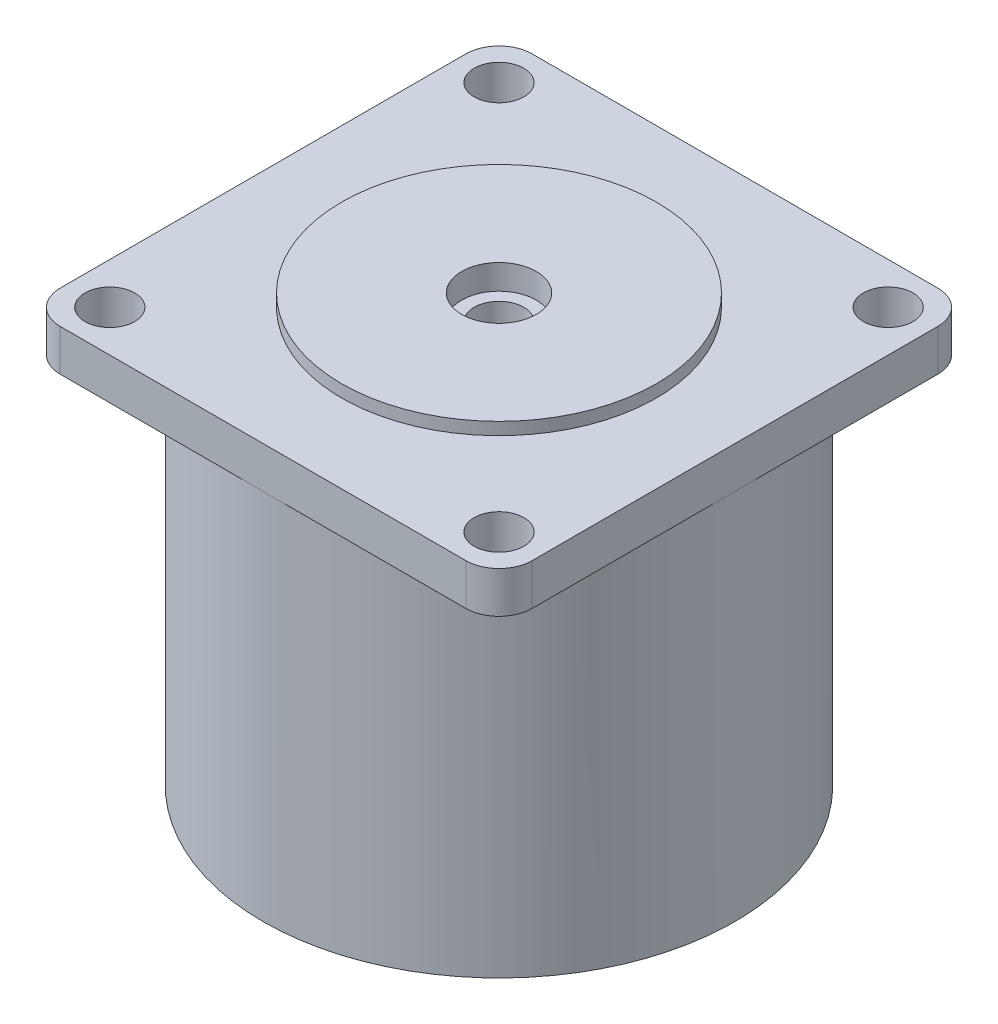
ISO-10303-21;
HEADER;
FILE_DESCRIPTION(('STEP AP214'),'2;1');
FILE_NAME('part.step','',(''),(''),'','','');
FILE_SCHEMA(('AUTOMOTIVE_DESIGN { 1 0 10303 214 1 1 1 1 }'));
ENDSEC;
DATA;
#1=APPLICATION_CONTEXT('core data for automotive mechanical design processes');
#2=APPLICATION_PROTOCOL_DEFINITION('international standard','automotive_design',2000,#1);
#3=PRODUCT_CONTEXT('',#1,'mechanical');
#4=PRODUCT('Part','Part','',(#3));
#5=PRODUCT_RELATED_PRODUCT_CATEGORY('part','',(#4));
#6=PRODUCT_DEFINITION_FORMATION('','',#4);
#7=PRODUCT_DEFINITION_CONTEXT('part definition',#1,'design');
#8=PRODUCT_DEFINITION('design','',#6,#7);
#9=PRODUCT_DEFINITION_SHAPE('','',#8);
#10=(LENGTH_UNIT() NAMED_UNIT(*) SI_UNIT(.MILLI.,.METRE.));
#11=(NAMED_UNIT(*) PLANE_ANGLE_UNIT() SI_UNIT($,.RADIAN.));
#12=(NAMED_UNIT(*) SI_UNIT($,.STERADIAN.) SOLID_ANGLE_UNIT());
#13=UNCERTAINTY_MEASURE_WITH_UNIT(LENGTH_MEASURE(1.E-05),#10,'distance_accuracy_value','');
#14=(GEOMETRIC_REPRESENTATION_CONTEXT(3) GLOBAL_UNCERTAINTY_ASSIGNED_CONTEXT((#13)) GLOBAL_UNIT_ASSIGNED_CONTEXT((#10,
#11,#12)) REPRESENTATION_CONTEXT('',''));
#15=CARTESIAN_POINT('',(0.,0.,0.));
#16=DIRECTION('',(0.,0.,1.));
#17=DIRECTION('',(1.,0.,0.));
#18=AXIS2_PLACEMENT_3D('',#15,#16,#17);
#19=CARTESIAN_POINT('',(0.,5.,0.));
#20=DIRECTION('',(0.,-1.,0.));
#21=DIRECTION('',(0.,0.,-1.));
#22=AXIS2_PLACEMENT_3D('',#19,#20,#21);
#23=PLANE('',#22);
#24=DIRECTION('',(1.,0.,0.));
#25=VECTOR('',#24,1.);
#26=CARTESIAN_POINT('',(28.5,5.,28.5));
#27=LINE('',#26,#25);
#28=CARTESIAN_POINT('',(-24.5,5.,28.5));
#29=VERTEX_POINT('',#28);
#30=CARTESIAN_POINT('',(24.5,5.,28.5));
#31=VERTEX_POINT('',#30);
#32=EDGE_CURVE('E176',#29,#31,#27,.T.);
#33=ORIENTED_EDGE('',*,*,#32,.T.);
#34=CARTESIAN_POINT('',(24.5,5.,24.5));
#35=DIRECTION('',(0.,-1.,0.));
#36=DIRECTION('',(0.,0.,-1.));
#37=AXIS2_PLACEMENT_3D('',#34,#35,#36);
#38=CIRCLE('',#37,4.);
#39=CARTESIAN_POINT('',(28.5,5.,24.5));
#40=VERTEX_POINT('',#39);
#41=EDGE_CURVE('E217',#31,#40,#38,.F.);
#42=ORIENTED_EDGE('',*,*,#41,.T.);
#43=DIRECTION('',(0.,0.,-1.));
#44=VECTOR('',#43,1.);
#45=CARTESIAN_POINT('',(28.5,5.,-28.5));
#46=LINE('',#45,#44);
#47=CARTESIAN_POINT('',(28.5,5.,-24.5));
#48=VERTEX_POINT('',#47);
#49=EDGE_CURVE('E180',#40,#48,#46,.T.);
#50=ORIENTED_EDGE('',*,*,#49,.T.);
#51=CARTESIAN_POINT('',(24.5,5.,-24.5));
#52=DIRECTION('',(0.,-1.,0.));
#53=DIRECTION('',(0.,0.,-1.));
#54=AXIS2_PLACEMENT_3D('',#51,#52,#53);
#55=CIRCLE('',#54,4.);
#56=CARTESIAN_POINT('',(24.5,5.,-28.5));
#57=VERTEX_POINT('',#56);
#58=EDGE_CURVE('E215',#48,#57,#55,.F.);
#59=ORIENTED_EDGE('',*,*,#58,.T.);
#60=DIRECTION('',(-1.,0.,0.));
#61=VECTOR('',#60,1.);
#62=CARTESIAN_POINT('',(-28.5,5.,-28.5));
#63=LINE('',#62,#61);
#64=CARTESIAN_POINT('',(-24.5,5.,-28.5));
#65=VERTEX_POINT('',#64);
#66=EDGE_CURVE('E183',#57,#65,#63,.T.);
#67=ORIENTED_EDGE('',*,*,#66,.T.);
#68=CARTESIAN_POINT('',(-24.5,5.,-24.5));
#69=DIRECTION('',(0.,-1.,0.));
#70=DIRECTION('',(0.,0.,-1.));
#71=AXIS2_PLACEMENT_3D('',#68,#69,#70);
#72=CIRCLE('',#71,4.);
#73=CARTESIAN_POINT('',(-28.5,5.,-24.5));
#74=VERTEX_POINT('',#73);
#75=EDGE_CURVE('E213',#65,#74,#72,.F.);
#76=ORIENTED_EDGE('',*,*,#75,.T.);
#77=DIRECTION('',(0.,0.,1.));
#78=VECTOR('',#77,1.);
#79=CARTESIAN_POINT('',(-28.5,5.,28.5));
#80=LINE('',#79,#78);
#81=CARTESIAN_POINT('',(-28.5,5.,24.5));
#82=VERTEX_POINT('',#81);
#83=EDGE_CURVE('E173',#74,#82,#80,.T.);
#84=ORIENTED_EDGE('',*,*,#83,.T.);
#85=CARTESIAN_POINT('',(-24.5,5.,24.5));
#86=DIRECTION('',(0.,-1.,0.));
#87=DIRECTION('',(0.,0.,-1.));
#88=AXIS2_PLACEMENT_3D('',#85,#86,#87);
#89=CIRCLE('',#88,4.);
#90=EDGE_CURVE('E211',#82,#29,#89,.F.);
#91=ORIENTED_EDGE('',*,*,#90,.T.);
#92=EDGE_LOOP('',(#33,#42,#50,#59,#67,#76,#84,#91));
#93=FACE_BOUND('',#92,.T.);
#94=CARTESIAN_POINT('',(-23.5,5.,-23.5));
#95=DIRECTION('',(0.,1.,0.));
#96=DIRECTION('',(0.,0.,1.));
#97=AXIS2_PLACEMENT_3D('',#94,#95,#96);
#98=CIRCLE('',#97,3.);
#99=CARTESIAN_POINT('',(-23.5,5.,-20.5));
#100=VERTEX_POINT('',#99);
#101=EDGE_CURVE('E164',#100,#100,#98,.T.);
#102=ORIENTED_EDGE('',*,*,#101,.F.);
#103=EDGE_LOOP('',(#102));
#104=FACE_BOUND('',#103,.T.);
#105=CARTESIAN_POINT('',(23.5,5.,-23.5));
#106=DIRECTION('',(0.,1.,0.));
#107=DIRECTION('',(0.,0.,1.));
#108=AXIS2_PLACEMENT_3D('',#105,#106,#107);
#109=CIRCLE('',#108,3.);
#110=CARTESIAN_POINT('',(23.5,5.,-20.5));
#111=VERTEX_POINT('',#110);
#112=EDGE_CURVE('E158',#111,#111,#109,.T.);
#113=ORIENTED_EDGE('',*,*,#112,.F.);
#114=EDGE_LOOP('',(#113));
#115=FACE_BOUND('',#114,.T.);
#116=CARTESIAN_POINT('',(23.5,5.,23.5));
#117=DIRECTION('',(0.,1.,0.));
#118=DIRECTION('',(0.,0.,1.));
#119=AXIS2_PLACEMENT_3D('',#116,#117,#118);
#120=CIRCLE('',#119,3.);
#121=CARTESIAN_POINT('',(23.5,5.,26.5));
#122=VERTEX_POINT('',#121);
#123=EDGE_CURVE('E151',#122,#122,#120,.T.);
#124=ORIENTED_EDGE('',*,*,#123,.F.);
#125=EDGE_LOOP('',(#124));
#126=FACE_BOUND('',#125,.T.);
#127=CARTESIAN_POINT('',(-23.5,5.,23.5));
#128=DIRECTION('',(0.,1.,0.));
#129=DIRECTION('',(0.,0.,1.));
#130=AXIS2_PLACEMENT_3D('',#127,#128,#129);
#131=CIRCLE('',#130,3.);
#132=CARTESIAN_POINT('',(-23.5,5.,26.5));
#133=VERTEX_POINT('',#132);
#134=EDGE_CURVE('E152',#133,#133,#131,.T.);
#135=ORIENTED_EDGE('',*,*,#134,.F.);
#136=EDGE_LOOP('',(#135));
#137=FACE_BOUND('',#136,.T.);
#138=CARTESIAN_POINT('',(0.,5.,0.));
#139=DIRECTION('',(0.,-1.,0.));
#140=DIRECTION('',(0.,0.,-1.));
#141=AXIS2_PLACEMENT_3D('',#138,#139,#140);
#142=CIRCLE('',#141,19.);
#143=CARTESIAN_POINT('',(0.,5.,-19.));
#144=VERTEX_POINT('',#143);
#145=EDGE_CURVE('E11',#144,#144,#142,.F.);
#146=ORIENTED_EDGE('',*,*,#145,.F.);
#147=EDGE_LOOP('',(#146));
#148=FACE_BOUND('',#147,.T.);
#149=ADVANCED_FACE('F32',(#93,#104,#115,#126,#137,#148),#23,.F.);
#150=CARTESIAN_POINT('',(0.,0.,0.));
#151=DIRECTION('',(0.,-1.,0.));
#152=DIRECTION('',(0.,0.,-1.));
#153=AXIS2_PLACEMENT_3D('',#150,#151,#152);
#154=PLANE('',#153);
#155=CARTESIAN_POINT('',(0.,0.,0.));
#156=DIRECTION('',(0.,-1.,0.));
#157=DIRECTION('',(0.,0.,-1.));
#158=AXIS2_PLACEMENT_3D('',#155,#156,#157);
#159=CIRCLE('',#158,28.5);
#160=CARTESIAN_POINT('',(0.,0.,-28.5));
#161=VERTEX_POINT('',#160);
#162=CARTESIAN_POINT('',(28.5,0.,0.));
#163=VERTEX_POINT('',#162);
#164=EDGE_CURVE('E131',#161,#163,#159,.T.);
#165=ORIENTED_EDGE('',*,*,#164,.F.);
#166=DIRECTION('',(-1.,0.,0.));
#167=VECTOR('',#166,1.);
#168=CARTESIAN_POINT('',(-28.5,0.,-28.5));
#169=LINE('',#168,#167);
#170=CARTESIAN_POINT('',(24.5,0.,-28.5));
#171=VERTEX_POINT('',#170);
#172=EDGE_CURVE('E112',#171,#161,#169,.T.);
#173=ORIENTED_EDGE('',*,*,#172,.F.);
#174=CARTESIAN_POINT('',(24.5,0.,-24.5));
#175=DIRECTION('',(0.,-1.,0.));
#176=DIRECTION('',(0.,0.,-1.));
#177=AXIS2_PLACEMENT_3D('',#174,#175,#176);
#178=CIRCLE('',#177,4.);
#179=CARTESIAN_POINT('',(28.5,0.,-24.5));
#180=VERTEX_POINT('',#179);
#181=EDGE_CURVE('E201',#171,#180,#178,.T.);
#182=ORIENTED_EDGE('',*,*,#181,.T.);
#183=DIRECTION('',(0.,0.,-1.));
#184=VECTOR('',#183,1.);
#185=CARTESIAN_POINT('',(28.5,0.,-28.5));
#186=LINE('',#185,#184);
#187=EDGE_CURVE('E134',#163,#180,#186,.T.);
#188=ORIENTED_EDGE('',*,*,#187,.F.);
#189=EDGE_LOOP('',(#165,#173,#182,#188));
#190=FACE_BOUND('',#189,.T.);
#191=CARTESIAN_POINT('',(23.5,0.,-23.5));
#192=DIRECTION('',(0.,1.,0.));
#193=DIRECTION('',(0.,0.,1.));
#194=AXIS2_PLACEMENT_3D('',#191,#192,#193);
#195=CIRCLE('',#194,3.);
#196=CARTESIAN_POINT('',(23.5,0.,-20.5));
#197=VERTEX_POINT('',#196);
#198=EDGE_CURVE('E161',#197,#197,#195,.T.);
#199=ORIENTED_EDGE('',*,*,#198,.T.);
#200=EDGE_LOOP('',(#199));
#201=FACE_BOUND('',#200,.T.);
#202=ADVANCED_FACE('F132',(#190,#201),#154,.T.);
#203=CARTESIAN_POINT('',(0.,0.,28.5));
#204=VERTEX_POINT('',#203);
#205=EDGE_CURVE('E40',#163,#204,#159,.T.);
#206=ORIENTED_EDGE('',*,*,#205,.F.);
#207=CARTESIAN_POINT('',(28.5,0.,24.5));
#208=VERTEX_POINT('',#207);
#209=EDGE_CURVE('E128',#208,#163,#186,.T.);
#210=ORIENTED_EDGE('',*,*,#209,.F.);
#211=CARTESIAN_POINT('',(24.5,0.,24.5));
#212=DIRECTION('',(0.,-1.,0.));
#213=DIRECTION('',(0.,0.,-1.));
#214=AXIS2_PLACEMENT_3D('',#211,#212,#213);
#215=CIRCLE('',#214,4.);
#216=CARTESIAN_POINT('',(24.5,0.,28.5));
#217=VERTEX_POINT('',#216);
#218=EDGE_CURVE('E203',#208,#217,#215,.T.);
#219=ORIENTED_EDGE('',*,*,#218,.T.);
#220=DIRECTION('',(1.,0.,0.));
#221=VECTOR('',#220,1.);
#222=CARTESIAN_POINT('',(28.5,0.,28.5));
#223=LINE('',#222,#221);
#224=EDGE_CURVE('E170',#204,#217,#223,.T.);
#225=ORIENTED_EDGE('',*,*,#224,.F.);
#226=EDGE_LOOP('',(#206,#210,#219,#225));
#227=FACE_BOUND('',#226,.T.);
#228=CARTESIAN_POINT('',(23.5,0.,23.5));
#229=DIRECTION('',(0.,1.,0.));
#230=DIRECTION('',(0.,0.,1.));
#231=AXIS2_PLACEMENT_3D('',#228,#229,#230);
#232=CIRCLE('',#231,3.);
#233=CARTESIAN_POINT('',(23.5,0.,26.5));
#234=VERTEX_POINT('',#233);
#235=EDGE_CURVE('E155',#234,#234,#232,.T.);
#236=ORIENTED_EDGE('',*,*,#235,.T.);
#237=EDGE_LOOP('',(#236));
#238=FACE_BOUND('',#237,.T.);
#239=ADVANCED_FACE('F250',(#227,#238),#154,.T.);
#240=CARTESIAN_POINT('',(-28.5,0.,0.));
#241=VERTEX_POINT('',#240);
#242=EDGE_CURVE('E54',#204,#241,#159,.T.);
#243=ORIENTED_EDGE('',*,*,#242,.F.);
#244=CARTESIAN_POINT('',(-24.5,0.,28.5));
#245=VERTEX_POINT('',#244);
#246=EDGE_CURVE('E187',#245,#204,#223,.T.);
#247=ORIENTED_EDGE('',*,*,#246,.F.);
#248=CARTESIAN_POINT('',(-24.5,0.,24.5));
#249=DIRECTION('',(0.,-1.,0.));
#250=DIRECTION('',(0.,0.,-1.));
#251=AXIS2_PLACEMENT_3D('',#248,#249,#250);
#252=CIRCLE('',#251,4.);
#253=CARTESIAN_POINT('',(-28.5,0.,24.5));
#254=VERTEX_POINT('',#253);
#255=EDGE_CURVE('E197',#245,#254,#252,.T.);
#256=ORIENTED_EDGE('',*,*,#255,.T.);
#257=DIRECTION('',(0.,0.,1.));
#258=VECTOR('',#257,1.);
#259=CARTESIAN_POINT('',(-28.5,0.,0.));
#260=LINE('',#259,#258);
#261=EDGE_CURVE('E122',#241,#254,#260,.T.);
#262=ORIENTED_EDGE('',*,*,#261,.F.);
#263=EDGE_LOOP('',(#243,#247,#256,#262));
#264=FACE_BOUND('',#263,.T.);
#265=CARTESIAN_POINT('',(-23.5,0.,23.5));
#266=DIRECTION('',(0.,1.,0.));
#267=DIRECTION('',(0.,0.,1.));
#268=AXIS2_PLACEMENT_3D('',#265,#266,#267);
#269=CIRCLE('',#268,3.);
#270=CARTESIAN_POINT('',(-23.5,0.,26.5));
#271=VERTEX_POINT('',#270);
#272=EDGE_CURVE('E148',#271,#271,#269,.T.);
#273=ORIENTED_EDGE('',*,*,#272,.T.);
#274=EDGE_LOOP('',(#273));
#275=FACE_BOUND('',#274,.T.);
#276=ADVANCED_FACE('F236',(#264,#275),#154,.T.);
#277=CARTESIAN_POINT('',(28.5,5.,28.5));
#278=DIRECTION('',(0.,0.,-1.));
#279=DIRECTION('',(-1.,0.,0.));
#280=AXIS2_PLACEMENT_3D('',#277,#278,#279);
#281=PLANE('',#280);
#282=ORIENTED_EDGE('',*,*,#246,.T.);
#283=ORIENTED_EDGE('',*,*,#224,.T.);
#284=DIRECTION('',(0.,-1.,0.));
#285=VECTOR('',#284,1.);
#286=CARTESIAN_POINT('',(24.5,5.,28.5));
#287=LINE('',#286,#285);
#288=EDGE_CURVE('E209',#217,#31,#287,.F.);
#289=ORIENTED_EDGE('',*,*,#288,.T.);
#290=ORIENTED_EDGE('',*,*,#32,.F.);
#291=DIRECTION('',(0.,-1.,0.));
#292=VECTOR('',#291,1.);
#293=CARTESIAN_POINT('',(-24.5,5.,28.5));
#294=LINE('',#293,#292);
#295=EDGE_CURVE('E206',#29,#245,#294,.T.);
#296=ORIENTED_EDGE('',*,*,#295,.T.);
#297=EDGE_LOOP('',(#282,#283,#289,#290,#296));
#298=FACE_BOUND('',#297,.T.);
#299=ADVANCED_FACE('F235',(#298),#281,.F.);
#300=CARTESIAN_POINT('',(28.5,5.,-28.5));
#301=DIRECTION('',(-1.,0.,0.));
#302=DIRECTION('',(0.,0.,1.));
#303=AXIS2_PLACEMENT_3D('',#300,#301,#302);
#304=PLANE('',#303);
#305=ORIENTED_EDGE('',*,*,#49,.F.);
#306=DIRECTION('',(0.,-1.,0.));
#307=VECTOR('',#306,1.);
#308=CARTESIAN_POINT('',(28.5,5.,24.5));
#309=LINE('',#308,#307);
#310=EDGE_CURVE('E194',#40,#208,#309,.T.);
#311=ORIENTED_EDGE('',*,*,#310,.T.);
#312=ORIENTED_EDGE('',*,*,#209,.T.);
#313=ORIENTED_EDGE('',*,*,#187,.T.);
#314=DIRECTION('',(0.,-1.,0.));
#315=VECTOR('',#314,1.);
#316=CARTESIAN_POINT('',(28.5,5.,-24.5));
#317=LINE('',#316,#315);
#318=EDGE_CURVE('E186',#180,#48,#317,.F.);
#319=ORIENTED_EDGE('',*,*,#318,.T.);
#320=EDGE_LOOP('',(#305,#311,#312,#313,#319));
#321=FACE_BOUND('',#320,.T.);
#322=ADVANCED_FACE('F246',(#321),#304,.F.);
#323=CARTESIAN_POINT('',(-28.5,5.,-28.5));
#324=DIRECTION('',(0.,0.,1.));
#325=DIRECTION('',(1.,0.,0.));
#326=AXIS2_PLACEMENT_3D('',#323,#324,#325);
#327=PLANE('',#326);
#328=ORIENTED_EDGE('',*,*,#66,.F.);
#329=DIRECTION('',(0.,-1.,0.));
#330=VECTOR('',#329,1.);
#331=CARTESIAN_POINT('',(24.5,5.,-28.5));
#332=LINE('',#331,#330);
#333=EDGE_CURVE('E118',#57,#171,#332,.T.);
#334=ORIENTED_EDGE('',*,*,#333,.T.);
#335=ORIENTED_EDGE('',*,*,#172,.T.);
#336=CARTESIAN_POINT('',(-24.5,0.,-28.5));
#337=VERTEX_POINT('',#336);
#338=EDGE_CURVE('E115',#161,#337,#169,.T.);
#339=ORIENTED_EDGE('',*,*,#338,.T.);
#340=DIRECTION('',(0.,-1.,0.));
#341=VECTOR('',#340,1.);
#342=CARTESIAN_POINT('',(-24.5,5.,-28.5));
#343=LINE('',#342,#341);
#344=EDGE_CURVE('E219',#337,#65,#343,.F.);
#345=ORIENTED_EDGE('',*,*,#344,.T.);
#346=EDGE_LOOP('',(#328,#334,#335,#339,#345));
#347=FACE_BOUND('',#346,.T.);
#348=ADVANCED_FACE('F114',(#347),#327,.F.);
#349=CARTESIAN_POINT('',(-28.5,5.,0.));
#350=DIRECTION('',(1.,0.,0.));
#351=DIRECTION('',(0.,0.,-1.));
#352=AXIS2_PLACEMENT_3D('',#349,#350,#351);
#353=PLANE('',#352);
#354=ORIENTED_EDGE('',*,*,#83,.F.);
#355=DIRECTION('',(0.,-1.,0.));
#356=VECTOR('',#355,1.);
#357=CARTESIAN_POINT('',(-28.5,5.,-24.5));
#358=LINE('',#357,#356);
#359=CARTESIAN_POINT('',(-28.5,0.,-24.5));
#360=VERTEX_POINT('',#359);
#361=EDGE_CURVE('E142',#74,#360,#358,.T.);
#362=ORIENTED_EDGE('',*,*,#361,.T.);
#363=EDGE_CURVE('E177',#360,#241,#260,.T.);
#364=ORIENTED_EDGE('',*,*,#363,.T.);
#365=ORIENTED_EDGE('',*,*,#261,.T.);
#366=DIRECTION('',(0.,-1.,0.));
#367=VECTOR('',#366,1.);
#368=CARTESIAN_POINT('',(-28.5,5.,24.5));
#369=LINE('',#368,#367);
#370=EDGE_CURVE('E144',#254,#82,#369,.F.);
#371=ORIENTED_EDGE('',*,*,#370,.T.);
#372=EDGE_LOOP('',(#354,#362,#364,#365,#371));
#373=FACE_BOUND('',#372,.T.);
#374=ADVANCED_FACE('F225',(#373),#353,.F.);
#375=EDGE_CURVE('E47',#241,#161,#159,.T.);
#376=ORIENTED_EDGE('',*,*,#375,.F.);
#377=ORIENTED_EDGE('',*,*,#363,.F.);
#378=CARTESIAN_POINT('',(-24.5,0.,-24.5));
#379=DIRECTION('',(0.,-1.,0.));
#380=DIRECTION('',(0.,0.,-1.));
#381=AXIS2_PLACEMENT_3D('',#378,#379,#380);
#382=CIRCLE('',#381,4.);
#383=EDGE_CURVE('E126',#360,#337,#382,.T.);
#384=ORIENTED_EDGE('',*,*,#383,.T.);
#385=ORIENTED_EDGE('',*,*,#338,.F.);
#386=EDGE_LOOP('',(#376,#377,#384,#385));
#387=FACE_BOUND('',#386,.T.);
#388=CARTESIAN_POINT('',(-23.5,0.,-23.5));
#389=DIRECTION('',(0.,1.,0.));
#390=DIRECTION('',(0.,0.,1.));
#391=AXIS2_PLACEMENT_3D('',#388,#389,#390);
#392=CIRCLE('',#391,3.);
#393=CARTESIAN_POINT('',(-23.5,0.,-20.5));
#394=VERTEX_POINT('',#393);
#395=EDGE_CURVE('E167',#394,#394,#392,.T.);
#396=ORIENTED_EDGE('',*,*,#395,.T.);
#397=EDGE_LOOP('',(#396));
#398=FACE_BOUND('',#397,.T.);
#399=ADVANCED_FACE('F124',(#387,#398),#154,.T.);
#400=CARTESIAN_POINT('',(24.5,5.,24.5));
#401=DIRECTION('',(0.,-1.,0.));
#402=DIRECTION('',(0.,0.,-1.));
#403=AXIS2_PLACEMENT_3D('',#400,#401,#402);
#404=CYLINDRICAL_SURFACE('',#403,4.);
#405=ORIENTED_EDGE('',*,*,#41,.F.);
#406=ORIENTED_EDGE('',*,*,#288,.F.);
#407=ORIENTED_EDGE('',*,*,#218,.F.);
#408=ORIENTED_EDGE('',*,*,#310,.F.);
#409=EDGE_LOOP('',(#405,#406,#407,#408));
#410=FACE_BOUND('',#409,.T.);
#411=ADVANCED_FACE('F255',(#410),#404,.T.);
#412=CARTESIAN_POINT('',(24.5,5.,-24.5));
#413=DIRECTION('',(0.,-1.,0.));
#414=DIRECTION('',(0.,0.,-1.));
#415=AXIS2_PLACEMENT_3D('',#412,#413,#414);
#416=CYLINDRICAL_SURFACE('',#415,4.);
#417=ORIENTED_EDGE('',*,*,#58,.F.);
#418=ORIENTED_EDGE('',*,*,#318,.F.);
#419=ORIENTED_EDGE('',*,*,#181,.F.);
#420=ORIENTED_EDGE('',*,*,#333,.F.);
#421=EDGE_LOOP('',(#417,#418,#419,#420));
#422=FACE_BOUND('',#421,.T.);
#423=ADVANCED_FACE('F244',(#422),#416,.T.);
#424=CARTESIAN_POINT('',(-24.5,5.,-24.5));
#425=DIRECTION('',(0.,-1.,0.));
#426=DIRECTION('',(0.,0.,-1.));
#427=AXIS2_PLACEMENT_3D('',#424,#425,#426);
#428=CYLINDRICAL_SURFACE('',#427,4.);
#429=ORIENTED_EDGE('',*,*,#75,.F.);
#430=ORIENTED_EDGE('',*,*,#344,.F.);
#431=ORIENTED_EDGE('',*,*,#383,.F.);
#432=ORIENTED_EDGE('',*,*,#361,.F.);
#433=EDGE_LOOP('',(#429,#430,#431,#432));
#434=FACE_BOUND('',#433,.T.);
#435=ADVANCED_FACE('F239',(#434),#428,.T.);
#436=CARTESIAN_POINT('',(-24.5,5.,24.5));
#437=DIRECTION('',(0.,-1.,0.));
#438=DIRECTION('',(0.,0.,-1.));
#439=AXIS2_PLACEMENT_3D('',#436,#437,#438);
#440=CYLINDRICAL_SURFACE('',#439,4.);
#441=ORIENTED_EDGE('',*,*,#90,.F.);
#442=ORIENTED_EDGE('',*,*,#370,.F.);
#443=ORIENTED_EDGE('',*,*,#255,.F.);
#444=ORIENTED_EDGE('',*,*,#295,.F.);
#445=EDGE_LOOP('',(#441,#442,#443,#444));
#446=FACE_BOUND('',#445,.T.);
#447=ADVANCED_FACE('F34',(#446),#440,.T.);
#448=CARTESIAN_POINT('',(-23.5,0.,-23.5));
#449=DIRECTION('',(0.,1.,0.));
#450=DIRECTION('',(0.,0.,1.));
#451=AXIS2_PLACEMENT_3D('',#448,#449,#450);
#452=CYLINDRICAL_SURFACE('',#451,3.);
#453=ORIENTED_EDGE('',*,*,#395,.F.);
#454=EDGE_LOOP('',(#453));
#455=FACE_BOUND('',#454,.T.);
#456=ORIENTED_EDGE('',*,*,#101,.T.);
#457=EDGE_LOOP('',(#456));
#458=FACE_BOUND('',#457,.T.);
#459=ADVANCED_FACE('F271',(#455,#458),#452,.F.);
#460=CARTESIAN_POINT('',(23.5,0.,-23.5));
#461=DIRECTION('',(0.,1.,0.));
#462=DIRECTION('',(0.,0.,1.));
#463=AXIS2_PLACEMENT_3D('',#460,#461,#462);
#464=CYLINDRICAL_SURFACE('',#463,3.);
#465=ORIENTED_EDGE('',*,*,#198,.F.);
#466=EDGE_LOOP('',(#465));
#467=FACE_BOUND('',#466,.T.);
#468=ORIENTED_EDGE('',*,*,#112,.T.);
#469=EDGE_LOOP('',(#468));
#470=FACE_BOUND('',#469,.T.);
#471=ADVANCED_FACE('F315',(#467,#470),#464,.F.);
#472=CARTESIAN_POINT('',(23.5,0.,23.5));
#473=DIRECTION('',(0.,1.,0.));
#474=DIRECTION('',(0.,0.,1.));
#475=AXIS2_PLACEMENT_3D('',#472,#473,#474);
#476=CYLINDRICAL_SURFACE('',#475,3.);
#477=ORIENTED_EDGE('',*,*,#235,.F.);
#478=EDGE_LOOP('',(#477));
#479=FACE_BOUND('',#478,.T.);
#480=ORIENTED_EDGE('',*,*,#123,.T.);
#481=EDGE_LOOP('',(#480));
#482=FACE_BOUND('',#481,.T.);
#483=ADVANCED_FACE('F303',(#479,#482),#476,.F.);
#484=CARTESIAN_POINT('',(-23.5,0.,23.5));
#485=DIRECTION('',(0.,1.,0.));
#486=DIRECTION('',(0.,0.,1.));
#487=AXIS2_PLACEMENT_3D('',#484,#485,#486);
#488=CYLINDRICAL_SURFACE('',#487,3.);
#489=ORIENTED_EDGE('',*,*,#272,.F.);
#490=EDGE_LOOP('',(#489));
#491=FACE_BOUND('',#490,.T.);
#492=ORIENTED_EDGE('',*,*,#134,.T.);
#493=EDGE_LOOP('',(#492));
#494=FACE_BOUND('',#493,.T.);
#495=ADVANCED_FACE('F298',(#491,#494),#488,.F.);
#496=CARTESIAN_POINT('',(0.,-45.,0.));
#497=DIRECTION('',(0.,1.,0.));
#498=DIRECTION('',(0.,0.,1.));
#499=AXIS2_PLACEMENT_3D('',#496,#497,#498);
#500=CYLINDRICAL_SURFACE('',#499,28.5);
#501=CARTESIAN_POINT('',(0.,-45.,0.));
#502=DIRECTION('',(0.,-1.,0.));
#503=DIRECTION('',(0.,0.,-1.));
#504=AXIS2_PLACEMENT_3D('',#501,#502,#503);
#505=CIRCLE('',#504,28.5);
#506=CARTESIAN_POINT('',(0.,-45.,-28.5));
#507=VERTEX_POINT('',#506);
#508=EDGE_CURVE('E138',#507,#507,#505,.T.);
#509=ORIENTED_EDGE('',*,*,#508,.F.);
#510=EDGE_LOOP('',(#509));
#511=FACE_BOUND('',#510,.T.);
#512=ORIENTED_EDGE('',*,*,#164,.T.);
#513=ORIENTED_EDGE('',*,*,#205,.T.);
#514=ORIENTED_EDGE('',*,*,#242,.T.);
#515=ORIENTED_EDGE('',*,*,#375,.T.);
#516=EDGE_LOOP('',(#512,#513,#514,#515));
#517=FACE_BOUND('',#516,.T.);
#518=ADVANCED_FACE('F141',(#511,#517),#500,.T.);
#519=CARTESIAN_POINT('',(0.,-45.,0.));
#520=DIRECTION('',(0.,-1.,0.));
#521=DIRECTION('',(0.,0.,-1.));
#522=AXIS2_PLACEMENT_3D('',#519,#520,#521);
#523=PLANE('',#522);
#524=CARTESIAN_POINT('',(0.,-45.,0.));
#525=DIRECTION('',(0.,1.,0.));
#526=DIRECTION('',(0.,0.,1.));
#527=AXIS2_PLACEMENT_3D('',#524,#525,#526);
#528=CIRCLE('',#527,3.);
#529=CARTESIAN_POINT('',(0.,-45.,3.));
#530=VERTEX_POINT('',#529);
#531=EDGE_CURVE('E470',#530,#530,#528,.T.);
#532=ORIENTED_EDGE('',*,*,#531,.T.);
#533=EDGE_LOOP('',(#532));
#534=FACE_BOUND('',#533,.T.);
#535=ORIENTED_EDGE('',*,*,#508,.T.);
#536=EDGE_LOOP('',(#535));
#537=FACE_BOUND('',#536,.T.);
#538=ADVANCED_FACE('F398',(#534,#537),#523,.T.);
#539=CARTESIAN_POINT('',(0.,6.5,0.));
#540=DIRECTION('',(0.,-1.,0.));
#541=DIRECTION('',(0.,0.,-1.));
#542=AXIS2_PLACEMENT_3D('',#539,#540,#541);
#543=CYLINDRICAL_SURFACE('',#542,19.);
#544=CARTESIAN_POINT('',(0.,6.5,0.));
#545=DIRECTION('',(0.,1.,0.));
#546=DIRECTION('',(0.,0.,1.));
#547=AXIS2_PLACEMENT_3D('',#544,#545,#546);
#548=CIRCLE('',#547,19.);
#549=CARTESIAN_POINT('',(0.,6.5,19.));
#550=VERTEX_POINT('',#549);
#551=EDGE_CURVE('E139',#550,#550,#548,.T.);
#552=ORIENTED_EDGE('',*,*,#551,.F.);
#553=EDGE_LOOP('',(#552));
#554=FACE_BOUND('',#553,.T.);
#555=ORIENTED_EDGE('',*,*,#145,.T.);
#556=EDGE_LOOP('',(#555));
#557=FACE_BOUND('',#556,.T.);
#558=ADVANCED_FACE('F412',(#554,#557),#543,.T.);
#559=CARTESIAN_POINT('',(0.,6.5,0.));
#560=DIRECTION('',(0.,1.,0.));
#561=DIRECTION('',(0.,0.,1.));
#562=AXIS2_PLACEMENT_3D('',#559,#560,#561);
#563=PLANE('',#562);
#564=CARTESIAN_POINT('',(0.,6.5,0.));
#565=DIRECTION('',(0.,1.,0.));
#566=DIRECTION('',(0.,0.,1.));
#567=AXIS2_PLACEMENT_3D('',#564,#565,#566);
#568=CIRCLE('',#567,4.5);
#569=CARTESIAN_POINT('',(0.,6.5,4.5));
#570=VERTEX_POINT('',#569);
#571=EDGE_CURVE('E475',#570,#570,#568,.T.);
#572=ORIENTED_EDGE('',*,*,#571,.F.);
#573=EDGE_LOOP('',(#572));
#574=FACE_BOUND('',#573,.T.);
#575=ORIENTED_EDGE('',*,*,#551,.T.);
#576=EDGE_LOOP('',(#575));
#577=FACE_BOUND('',#576,.T.);
#578=ADVANCED_FACE('F416',(#574,#577),#563,.T.);
#579=CARTESIAN_POINT('',(0.,3.5,0.));
#580=DIRECTION('',(0.,1.,0.));
#581=DIRECTION('',(0.,0.,1.));
#582=AXIS2_PLACEMENT_3D('',#579,#580,#581);
#583=CYLINDRICAL_SURFACE('',#582,4.5);
#584=CARTESIAN_POINT('',(0.,3.5,0.));
#585=DIRECTION('',(0.,1.,0.));
#586=DIRECTION('',(0.,0.,1.));
#587=AXIS2_PLACEMENT_3D('',#584,#585,#586);
#588=CIRCLE('',#587,4.5);
#589=CARTESIAN_POINT('',(0.,3.5,4.5));
#590=VERTEX_POINT('',#589);
#591=EDGE_CURVE('E478',#590,#590,#588,.T.);
#592=ORIENTED_EDGE('',*,*,#591,.F.);
#593=EDGE_LOOP('',(#592));
#594=FACE_BOUND('',#593,.T.);
#595=ORIENTED_EDGE('',*,*,#571,.T.);
#596=EDGE_LOOP('',(#595));
#597=FACE_BOUND('',#596,.T.);
#598=ADVANCED_FACE('F426',(#594,#597),#583,.F.);
#599=CARTESIAN_POINT('',(0.,3.5,0.));
#600=DIRECTION('',(0.,1.,0.));
#601=DIRECTION('',(0.,0.,1.));
#602=AXIS2_PLACEMENT_3D('',#599,#600,#601);
#603=PLANE('',#602);
#604=CARTESIAN_POINT('',(0.,3.5,0.));
#605=DIRECTION('',(0.,1.,0.));
#606=DIRECTION('',(0.,0.,1.));
#607=AXIS2_PLACEMENT_3D('',#604,#605,#606);
#608=CIRCLE('',#607,3.);
#609=CARTESIAN_POINT('',(0.,3.5,3.));
#610=VERTEX_POINT('',#609);
#611=EDGE_CURVE('E473',#610,#610,#608,.T.);
#612=ORIENTED_EDGE('',*,*,#611,.F.);
#613=EDGE_LOOP('',(#612));
#614=FACE_BOUND('',#613,.T.);
#615=ORIENTED_EDGE('',*,*,#591,.T.);
#616=EDGE_LOOP('',(#615));
#617=FACE_BOUND('',#616,.T.);
#618=ADVANCED_FACE('F436',(#614,#617),#603,.T.);
#619=CARTESIAN_POINT('',(0.,-45.,0.));
#620=DIRECTION('',(0.,1.,0.));
#621=DIRECTION('',(0.,0.,1.));
#622=AXIS2_PLACEMENT_3D('',#619,#620,#621);
#623=CYLINDRICAL_SURFACE('',#622,3.);
#624=CARTESIAN_POINT('',(0.,-45.,3.));
#625=CARTESIAN_POINT('',(0.,-44.4947916666667,3.));
#626=CARTESIAN_POINT('',(0.,-43.9895833333333,3.));
#627=CARTESIAN_POINT('',(0.,-42.9791666666667,3.));
#628=CARTESIAN_POINT('',(0.,-42.4739583333333,3.));
#629=CARTESIAN_POINT('',(0.,-41.4635416666667,3.));
#630=CARTESIAN_POINT('',(0.,-40.9583333333333,3.));
#631=CARTESIAN_POINT('',(0.,-39.9479166666667,3.));
#632=CARTESIAN_POINT('',(0.,-39.4427083333333,3.));
#633=CARTESIAN_POINT('',(0.,-38.4322916666667,3.));
#634=CARTESIAN_POINT('',(0.,-37.9270833333333,3.));
#635=CARTESIAN_POINT('',(0.,-36.9166666666667,3.));
#636=CARTESIAN_POINT('',(0.,-36.4114583333333,3.));
#637=CARTESIAN_POINT('',(0.,-35.4010416666667,3.));
#638=CARTESIAN_POINT('',(0.,-34.8958333333333,3.));
#639=CARTESIAN_POINT('',(0.,-33.8854166666667,3.));
#640=CARTESIAN_POINT('',(0.,-33.3802083333333,3.));
#641=CARTESIAN_POINT('',(0.,-32.3697916666667,3.));
#642=CARTESIAN_POINT('',(0.,-31.8645833333333,3.));
#643=CARTESIAN_POINT('',(0.,-30.8541666666667,3.));
#644=CARTESIAN_POINT('',(0.,-30.3489583333333,3.));
#645=CARTESIAN_POINT('',(0.,-29.3385416666667,3.));
#646=CARTESIAN_POINT('',(0.,-28.8333333333333,3.));
#647=CARTESIAN_POINT('',(0.,-27.8229166666667,3.));
#648=CARTESIAN_POINT('',(0.,-27.3177083333333,3.));
#649=CARTESIAN_POINT('',(0.,-26.3072916666667,3.));
#650=CARTESIAN_POINT('',(0.,-25.8020833333333,3.));
#651=CARTESIAN_POINT('',(0.,-24.7916666666667,3.));
#652=CARTESIAN_POINT('',(0.,-24.2864583333333,3.));
#653=CARTESIAN_POINT('',(0.,-23.2760416666667,3.));
#654=CARTESIAN_POINT('',(0.,-22.7708333333333,3.));
#655=CARTESIAN_POINT('',(0.,-21.7604166666667,3.));
#656=CARTESIAN_POINT('',(0.,-21.2552083333333,3.));
#657=CARTESIAN_POINT('',(0.,-20.2447916666667,3.));
#658=CARTESIAN_POINT('',(0.,-19.7395833333333,3.));
#659=CARTESIAN_POINT('',(0.,-18.7291666666667,3.));
#660=CARTESIAN_POINT('',(0.,-18.2239583333333,3.));
#661=CARTESIAN_POINT('',(0.,-17.2135416666667,3.));
#662=CARTESIAN_POINT('',(0.,-16.7083333333333,3.));
#663=CARTESIAN_POINT('',(0.,-15.6979166666667,3.));
#664=CARTESIAN_POINT('',(0.,-15.1927083333333,3.));
#665=CARTESIAN_POINT('',(0.,-14.1822916666667,3.));
#666=CARTESIAN_POINT('',(0.,-13.6770833333333,3.));
#667=CARTESIAN_POINT('',(0.,-12.6666666666667,3.));
#668=CARTESIAN_POINT('',(0.,-12.1614583333333,3.));
#669=CARTESIAN_POINT('',(0.,-11.1510416666667,3.));
#670=CARTESIAN_POINT('',(0.,-10.6458333333333,3.));
#671=CARTESIAN_POINT('',(0.,-9.63541666666667,3.));
#672=CARTESIAN_POINT('',(0.,-9.13020833333334,3.));
#673=CARTESIAN_POINT('',(0.,-8.11979166666667,3.));
#674=CARTESIAN_POINT('',(0.,-7.61458333333334,3.));
#675=CARTESIAN_POINT('',(0.,-6.60416666666667,3.));
#676=CARTESIAN_POINT('',(0.,-6.09895833333334,3.));
#677=CARTESIAN_POINT('',(0.,-5.08854166666667,3.));
#678=CARTESIAN_POINT('',(0.,-4.58333333333334,3.));
#679=CARTESIAN_POINT('',(0.,-3.57291666666667,3.));
#680=CARTESIAN_POINT('',(0.,-3.06770833333334,3.));
#681=CARTESIAN_POINT('',(0.,-2.05729166666667,3.));
#682=CARTESIAN_POINT('',(0.,-1.55208333333334,3.));
#683=CARTESIAN_POINT('',(0.,-0.54166666666667,3.));
#684=CARTESIAN_POINT('',(0.,-0.0364583333333363,3.));
#685=CARTESIAN_POINT('',(0.,0.97395833333333,3.));
#686=CARTESIAN_POINT('',(0.,1.47916666666666,3.));
#687=CARTESIAN_POINT('',(0.,2.48958333333333,3.));
#688=CARTESIAN_POINT('',(0.,2.99479166666666,3.));
#689=CARTESIAN_POINT('',(0.,3.5,3.));
#690=B_SPLINE_CURVE_WITH_KNOTS('',3,(#624,#625,#626,#627,#628,#629,#630,#631,#632,#633,#634,
#635,#636,#637,#638,#639,#640,#641,#642,#643,#644,#645,#646,#647,#648,#649,#650,#651,#652,#653,
#654,#655,#656,#657,#658,#659,#660,#661,#662,#663,#664,#665,#666,#667,#668,#669,#670,#671,#672,
#673,#674,#675,#676,#677,#678,#679,#680,#681,#682,#683,#684,#685,#686,#687,#688,#689),
.UNSPECIFIED.,.F.,.F.,(4,2,2,2,2,2,2,2,2,2,2,2,2,2,2,2,2,2,2,2,2,2,2,2,2,2,2,2,2,2,2,2,4),(0.,
1.51562500000001,3.03125000000001,4.54687500000001,6.06250000000001,7.57812500000001,
9.09375000000001,10.609375,12.125,13.640625,15.15625,16.671875,18.1875,19.703125,21.21875,
22.734375,24.25,25.765625,27.28125,28.796875,30.3125,31.828125,33.34375,34.859375,36.375,
37.890625,39.40625,40.921875,42.4375,43.953125,45.46875,46.984375,48.5),.UNSPECIFIED.);
#691=EDGE_CURVE('BSEAM453',#530,#610,#690,.T.);
#692=ORIENTED_EDGE('',*,*,#531,.F.);
#693=ORIENTED_EDGE('',*,*,#611,.T.);
#694=ORIENTED_EDGE('',*,*,#691,.T.);
#695=ORIENTED_EDGE('',*,*,#691,.F.);
#696=EDGE_LOOP('',(#692,#694,#693,#695));
#697=FACE_BOUND('',#696,.T.);
#698=ADVANCED_FACE('F453',(#697),#623,.F.);
#699=CLOSED_SHELL('',(#149,#202,#239,#276,#299,#322,#348,#374,#399,#411,#423,#435,#447,#459,
#471,#483,#495,#518,#538,#558,#578,#598,#618,#698));
#700=MANIFOLD_SOLID_BREP('B2',#699);
#701=ADVANCED_BREP_SHAPE_REPRESENTATION('',(#18,#700),#14);
#702=SHAPE_DEFINITION_REPRESENTATION(#9,#701);
ENDSEC;
END-ISO-10303-21;
